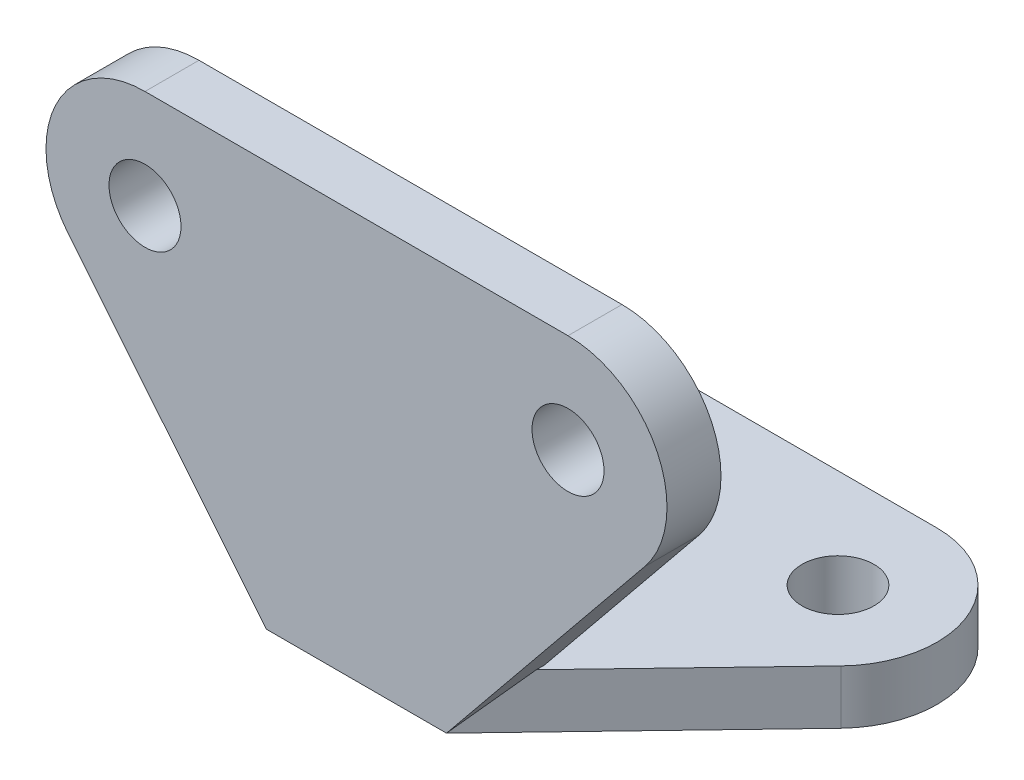
ISO-10303-21;
HEADER;
FILE_DESCRIPTION(('STEP AP214'),'2;1');
FILE_NAME('part.step','',(''),(''),'','','');
FILE_SCHEMA(('AUTOMOTIVE_DESIGN { 1 0 10303 214 1 1 1 1 }'));
ENDSEC;
DATA;
#1=APPLICATION_CONTEXT('core data for automotive mechanical design processes');
#2=APPLICATION_PROTOCOL_DEFINITION('international standard','automotive_design',2000,#1);
#3=PRODUCT_CONTEXT('',#1,'mechanical');
#4=PRODUCT('Part','Part','',(#3));
#5=PRODUCT_RELATED_PRODUCT_CATEGORY('part','',(#4));
#6=PRODUCT_DEFINITION_FORMATION('','',#4);
#7=PRODUCT_DEFINITION_CONTEXT('part definition',#1,'design');
#8=PRODUCT_DEFINITION('design','',#6,#7);
#9=PRODUCT_DEFINITION_SHAPE('','',#8);
#10=(LENGTH_UNIT() NAMED_UNIT(*) SI_UNIT(.MILLI.,.METRE.));
#11=(NAMED_UNIT(*) PLANE_ANGLE_UNIT() SI_UNIT($,.RADIAN.));
#12=(NAMED_UNIT(*) SI_UNIT($,.STERADIAN.) SOLID_ANGLE_UNIT());
#13=UNCERTAINTY_MEASURE_WITH_UNIT(LENGTH_MEASURE(1.E-05),#10,'distance_accuracy_value','');
#14=(GEOMETRIC_REPRESENTATION_CONTEXT(3) GLOBAL_UNCERTAINTY_ASSIGNED_CONTEXT((#13)) GLOBAL_UNIT_ASSIGNED_CONTEXT((#10,
#11,#12)) REPRESENTATION_CONTEXT('',''));
#15=CARTESIAN_POINT('',(0.,0.,0.));
#16=DIRECTION('',(0.,0.,1.));
#17=DIRECTION('',(1.,0.,0.));
#18=AXIS2_PLACEMENT_3D('',#15,#16,#17);
#19=CARTESIAN_POINT('',(-11.75,3.,0.));
#20=DIRECTION('',(0.,-1.,0.));
#21=DIRECTION('',(0.,0.,-1.));
#22=AXIS2_PLACEMENT_3D('',#19,#20,#21);
#23=PLANE('',#22);
#24=CARTESIAN_POINT('',(11.75,3.,0.));
#25=DIRECTION('',(0.,1.,0.));
#26=DIRECTION('',(0.,0.,1.));
#27=AXIS2_PLACEMENT_3D('',#24,#25,#26);
#28=CIRCLE('',#27,2.);
#29=CARTESIAN_POINT('',(11.75,3.,2.));
#30=VERTEX_POINT('',#29);
#31=EDGE_CURVE('E158',#30,#30,#28,.T.);
#32=ORIENTED_EDGE('',*,*,#31,.F.);
#33=EDGE_LOOP('',(#32));
#34=FACE_BOUND('',#33,.T.);
#35=CARTESIAN_POINT('',(-11.75,3.,0.));
#36=DIRECTION('',(0.,1.,0.));
#37=DIRECTION('',(0.,0.,1.));
#38=AXIS2_PLACEMENT_3D('',#35,#36,#37);
#39=CIRCLE('',#38,2.);
#40=CARTESIAN_POINT('',(-11.75,3.,2.));
#41=VERTEX_POINT('',#40);
#42=EDGE_CURVE('E167',#41,#41,#39,.T.);
#43=ORIENTED_EDGE('',*,*,#42,.F.);
#44=EDGE_LOOP('',(#43));
#45=FACE_BOUND('',#44,.T.);
#46=DIRECTION('',(0.,0.,-1.));
#47=VECTOR('',#46,1.);
#48=CARTESIAN_POINT('',(-5.,3.,3.80415742729705));
#49=LINE('',#48,#47);
#50=CARTESIAN_POINT('',(-5.,3.,12.));
#51=VERTEX_POINT('',#50);
#52=CARTESIAN_POINT('',(-5.,3.,3.80415742729705));
#53=VERTEX_POINT('',#52);
#54=EDGE_CURVE('E510',#51,#53,#49,.T.);
#55=ORIENTED_EDGE('',*,*,#54,.T.);
#56=DIRECTION('',(1.,0.,0.));
#57=VECTOR('',#56,1.);
#58=CARTESIAN_POINT('',(-5.,3.,3.80415742729705));
#59=LINE('',#58,#57);
#60=CARTESIAN_POINT('',(5.,3.,3.80415742729705));
#61=VERTEX_POINT('',#60);
#62=EDGE_CURVE('E149',#53,#61,#59,.T.);
#63=ORIENTED_EDGE('',*,*,#62,.T.);
#64=DIRECTION('',(0.,0.,-1.));
#65=VECTOR('',#64,1.);
#66=CARTESIAN_POINT('',(5.,3.,3.80415742729705));
#67=LINE('',#66,#65);
#68=CARTESIAN_POINT('',(5.,3.,12.));
#69=VERTEX_POINT('',#68);
#70=EDGE_CURVE('E140',#69,#61,#67,.T.);
#71=ORIENTED_EDGE('',*,*,#70,.F.);
#72=DIRECTION('',(-1.,0.,0.));
#73=VECTOR('',#72,1.);
#74=CARTESIAN_POINT('',(-11.75,3.,12.));
#75=LINE('',#74,#73);
#76=CARTESIAN_POINT('',(7.44284118996303,3.,12.));
#77=VERTEX_POINT('',#76);
#78=EDGE_CURVE('E147',#77,#69,#75,.T.);
#79=ORIENTED_EDGE('',*,*,#78,.F.);
#80=DIRECTION('',(0.,0.,1.));
#81=VECTOR('',#80,1.);
#82=CARTESIAN_POINT('',(7.44284118996303,3.,0.));
#83=LINE('',#82,#81);
#84=CARTESIAN_POINT('',(7.44284118996303,3.,12.4492491203827));
#85=VERTEX_POINT('',#84);
#86=EDGE_CURVE('E238',#77,#85,#83,.T.);
#87=ORIENTED_EDGE('',*,*,#86,.T.);
#88=DIRECTION('',(0.691664986781282,0.,-0.72221848914359));
#89=VECTOR('',#88,1.);
#90=CARTESIAN_POINT('',(15.7222016902897,3.,3.80415742729705));
#91=LINE('',#90,#89);
#92=CARTESIAN_POINT('',(15.7222016902897,3.,3.80415742729705));
#93=VERTEX_POINT('',#92);
#94=EDGE_CURVE('E180',#85,#93,#91,.T.);
#95=ORIENTED_EDGE('',*,*,#94,.T.);
#96=CARTESIAN_POINT('',(11.75,3.,0.));
#97=DIRECTION('',(0.,1.,0.));
#98=DIRECTION('',(0.,0.,-1.));
#99=AXIS2_PLACEMENT_3D('',#96,#97,#98);
#100=CIRCLE('',#99,5.5);
#101=CARTESIAN_POINT('',(11.75,3.,-5.5));
#102=VERTEX_POINT('',#101);
#103=EDGE_CURVE('E182',#93,#102,#100,.T.);
#104=ORIENTED_EDGE('',*,*,#103,.T.);
#105=DIRECTION('',(-1.,0.,0.));
#106=VECTOR('',#105,1.);
#107=CARTESIAN_POINT('',(-11.75,3.,-5.5));
#108=LINE('',#107,#106);
#109=CARTESIAN_POINT('',(-11.75,3.,-5.5));
#110=VERTEX_POINT('',#109);
#111=EDGE_CURVE('E184',#102,#110,#108,.T.);
#112=ORIENTED_EDGE('',*,*,#111,.T.);
#113=CARTESIAN_POINT('',(-11.75,3.,0.));
#114=DIRECTION('',(0.,1.,0.));
#115=DIRECTION('',(0.,0.,-1.));
#116=AXIS2_PLACEMENT_3D('',#113,#114,#115);
#117=CIRCLE('',#116,5.5);
#118=CARTESIAN_POINT('',(-15.7222016902897,3.,3.80415742729705));
#119=VERTEX_POINT('',#118);
#120=EDGE_CURVE('E173',#110,#119,#117,.T.);
#121=ORIENTED_EDGE('',*,*,#120,.T.);
#122=DIRECTION('',(0.691664986781282,0.,0.722218489143589));
#123=VECTOR('',#122,1.);
#124=CARTESIAN_POINT('',(-5.,3.,15.));
#125=LINE('',#124,#123);
#126=CARTESIAN_POINT('',(-7.44284118996303,3.,12.4492491203827));
#127=VERTEX_POINT('',#126);
#128=EDGE_CURVE('E176',#119,#127,#125,.T.);
#129=ORIENTED_EDGE('',*,*,#128,.T.);
#130=DIRECTION('',(0.,0.,-1.));
#131=VECTOR('',#130,1.);
#132=CARTESIAN_POINT('',(-7.44284118996303,3.,0.));
#133=LINE('',#132,#131);
#134=CARTESIAN_POINT('',(-7.44284118996303,3.,12.));
#135=VERTEX_POINT('',#134);
#136=EDGE_CURVE('E160',#127,#135,#133,.T.);
#137=ORIENTED_EDGE('',*,*,#136,.T.);
#138=EDGE_CURVE('E60',#51,#135,#75,.T.);
#139=ORIENTED_EDGE('',*,*,#138,.F.);
#140=EDGE_LOOP('',(#55,#63,#71,#79,#87,#95,#104,#112,#121,#129,#137,#139));
#141=FACE_BOUND('',#140,.T.);
#142=ADVANCED_FACE('F36',(#34,#45,#141),#23,.F.);
#143=CARTESIAN_POINT('',(11.75,16.9999999999999,12.));
#144=DIRECTION('',(0.,0.,1.));
#145=DIRECTION('',(1.,0.,0.));
#146=AXIS2_PLACEMENT_3D('',#143,#144,#145);
#147=PLANE('',#146);
#148=CARTESIAN_POINT('',(11.75,16.9999999999999,12.));
#149=DIRECTION('',(0.,0.,1.));
#150=DIRECTION('',(1.,0.,0.));
#151=AXIS2_PLACEMENT_3D('',#148,#149,#150);
#152=CIRCLE('',#151,2.);
#153=CARTESIAN_POINT('',(13.75,16.9999999999999,12.));
#154=VERTEX_POINT('',#153);
#155=EDGE_CURVE('E262',#154,#154,#152,.T.);
#156=ORIENTED_EDGE('',*,*,#155,.T.);
#157=EDGE_LOOP('',(#156));
#158=FACE_BOUND('',#157,.T.);
#159=CARTESIAN_POINT('',(-11.75,16.9999999999999,12.));
#160=DIRECTION('',(0.,0.,1.));
#161=DIRECTION('',(1.,0.,0.));
#162=AXIS2_PLACEMENT_3D('',#159,#160,#161);
#163=CIRCLE('',#162,2.);
#164=CARTESIAN_POINT('',(-9.75,16.9999999999999,12.));
#165=VERTEX_POINT('',#164);
#166=EDGE_CURVE('E519',#165,#165,#163,.T.);
#167=ORIENTED_EDGE('',*,*,#166,.T.);
#168=EDGE_LOOP('',(#167));
#169=FACE_BOUND('',#168,.T.);
#170=DIRECTION('',(0.,-1.,0.));
#171=VECTOR('',#170,1.);
#172=CARTESIAN_POINT('',(-5.,3.,12.));
#173=LINE('',#172,#171);
#174=CARTESIAN_POINT('',(-5.,13.5271687493917,12.));
#175=VERTEX_POINT('',#174);
#176=EDGE_CURVE('E508',#175,#51,#173,.T.);
#177=ORIENTED_EDGE('',*,*,#176,.T.);
#178=ORIENTED_EDGE('',*,*,#138,.T.);
#179=DIRECTION('',(0.631423863746935,-0.775437879066332,0.));
#180=VECTOR('',#179,1.);
#181=CARTESIAN_POINT('',(-16.0149083348649,13.5271687493917,12.));
#182=LINE('',#181,#180);
#183=CARTESIAN_POINT('',(-16.0149083348649,13.5271687493917,12.));
#184=VERTEX_POINT('',#183);
#185=EDGE_CURVE('E248',#184,#135,#182,.T.);
#186=ORIENTED_EDGE('',*,*,#185,.F.);
#187=CARTESIAN_POINT('',(-11.75,16.9999999999999,12.));
#188=DIRECTION('',(0.,0.,1.));
#189=DIRECTION('',(1.,0.,0.));
#190=AXIS2_PLACEMENT_3D('',#187,#188,#189);
#191=CIRCLE('',#190,5.5000000000001);
#192=CARTESIAN_POINT('',(-11.75,22.5,12.));
#193=VERTEX_POINT('',#192);
#194=EDGE_CURVE('E253',#193,#184,#191,.T.);
#195=ORIENTED_EDGE('',*,*,#194,.F.);
#196=DIRECTION('',(-1.,0.,0.));
#197=VECTOR('',#196,1.);
#198=CARTESIAN_POINT('',(11.75,22.5,12.));
#199=LINE('',#198,#197);
#200=CARTESIAN_POINT('',(11.75,22.5,12.));
#201=VERTEX_POINT('',#200);
#202=EDGE_CURVE('E230',#201,#193,#199,.T.);
#203=ORIENTED_EDGE('',*,*,#202,.F.);
#204=CARTESIAN_POINT('',(11.75,16.9999999999999,12.));
#205=DIRECTION('',(0.,0.,1.));
#206=DIRECTION('',(1.,0.,0.));
#207=AXIS2_PLACEMENT_3D('',#204,#205,#206);
#208=CIRCLE('',#207,5.50000000000009);
#209=CARTESIAN_POINT('',(16.0149083348649,13.5271687493917,12.));
#210=VERTEX_POINT('',#209);
#211=EDGE_CURVE('E226',#210,#201,#208,.T.);
#212=ORIENTED_EDGE('',*,*,#211,.F.);
#213=DIRECTION('',(0.631423863746935,0.775437879066332,0.));
#214=VECTOR('',#213,1.);
#215=CARTESIAN_POINT('',(5.,0.,12.));
#216=LINE('',#215,#214);
#217=EDGE_CURVE('E154',#77,#210,#216,.T.);
#218=ORIENTED_EDGE('',*,*,#217,.F.);
#219=ORIENTED_EDGE('',*,*,#78,.T.);
#220=DIRECTION('',(0.,-1.,0.));
#221=VECTOR('',#220,1.);
#222=CARTESIAN_POINT('',(5.,3.,12.));
#223=LINE('',#222,#221);
#224=CARTESIAN_POINT('',(5.,13.5271687493917,12.));
#225=VERTEX_POINT('',#224);
#226=EDGE_CURVE('E137',#225,#69,#223,.T.);
#227=ORIENTED_EDGE('',*,*,#226,.F.);
#228=DIRECTION('',(1.,0.,0.));
#229=VECTOR('',#228,1.);
#230=CARTESIAN_POINT('',(-5.,13.5271687493917,12.));
#231=LINE('',#230,#229);
#232=EDGE_CURVE('E515',#175,#225,#231,.T.);
#233=ORIENTED_EDGE('',*,*,#232,.F.);
#234=EDGE_LOOP('',(#177,#178,#186,#195,#203,#212,#218,#219,#227,#233));
#235=FACE_BOUND('',#234,.T.);
#236=ADVANCED_FACE('F152',(#158,#169,#235),#147,.F.);
#237=CARTESIAN_POINT('',(-11.75,0.,0.));
#238=DIRECTION('',(0.,-1.,0.));
#239=DIRECTION('',(0.,0.,-1.));
#240=AXIS2_PLACEMENT_3D('',#237,#238,#239);
#241=PLANE('',#240);
#242=DIRECTION('',(0.691664986781282,0.,-0.72221848914359));
#243=VECTOR('',#242,1.);
#244=CARTESIAN_POINT('',(15.7222016902897,0.,3.80415742729705));
#245=LINE('',#244,#243);
#246=CARTESIAN_POINT('',(5.,0.,15.));
#247=VERTEX_POINT('',#246);
#248=CARTESIAN_POINT('',(15.7222016902897,0.,3.80415742729705));
#249=VERTEX_POINT('',#248);
#250=EDGE_CURVE('E194',#247,#249,#245,.T.);
#251=ORIENTED_EDGE('',*,*,#250,.F.);
#252=DIRECTION('',(1.,0.,0.));
#253=VECTOR('',#252,1.);
#254=CARTESIAN_POINT('',(5.,0.,15.));
#255=LINE('',#254,#253);
#256=CARTESIAN_POINT('',(-5.,0.,15.));
#257=VERTEX_POINT('',#256);
#258=EDGE_CURVE('E191',#257,#247,#255,.T.);
#259=ORIENTED_EDGE('',*,*,#258,.F.);
#260=DIRECTION('',(0.691664986781282,0.,0.722218489143589));
#261=VECTOR('',#260,1.);
#262=CARTESIAN_POINT('',(-5.,0.,15.));
#263=LINE('',#262,#261);
#264=CARTESIAN_POINT('',(-15.7222016902897,0.,3.80415742729705));
#265=VERTEX_POINT('',#264);
#266=EDGE_CURVE('E189',#265,#257,#263,.T.);
#267=ORIENTED_EDGE('',*,*,#266,.F.);
#268=CARTESIAN_POINT('',(-11.75,0.,0.));
#269=DIRECTION('',(0.,1.,0.));
#270=DIRECTION('',(0.,0.,-1.));
#271=AXIS2_PLACEMENT_3D('',#268,#269,#270);
#272=CIRCLE('',#271,5.5);
#273=CARTESIAN_POINT('',(-11.75,0.,-5.5));
#274=VERTEX_POINT('',#273);
#275=EDGE_CURVE('E170',#274,#265,#272,.T.);
#276=ORIENTED_EDGE('',*,*,#275,.F.);
#277=DIRECTION('',(-1.,0.,0.));
#278=VECTOR('',#277,1.);
#279=CARTESIAN_POINT('',(-11.75,0.,-5.5));
#280=LINE('',#279,#278);
#281=CARTESIAN_POINT('',(11.75,0.,-5.5));
#282=VERTEX_POINT('',#281);
#283=EDGE_CURVE('E177',#282,#274,#280,.T.);
#284=ORIENTED_EDGE('',*,*,#283,.F.);
#285=CARTESIAN_POINT('',(11.75,0.,0.));
#286=DIRECTION('',(0.,1.,0.));
#287=DIRECTION('',(0.,0.,-1.));
#288=AXIS2_PLACEMENT_3D('',#285,#286,#287);
#289=CIRCLE('',#288,5.5);
#290=EDGE_CURVE('E196',#249,#282,#289,.T.);
#291=ORIENTED_EDGE('',*,*,#290,.F.);
#292=EDGE_LOOP('',(#251,#259,#267,#276,#284,#291));
#293=FACE_BOUND('',#292,.T.);
#294=CARTESIAN_POINT('',(-11.75,0.,0.));
#295=DIRECTION('',(0.,1.,0.));
#296=DIRECTION('',(0.,0.,1.));
#297=AXIS2_PLACEMENT_3D('',#294,#295,#296);
#298=CIRCLE('',#297,2.);
#299=CARTESIAN_POINT('',(-11.75,0.,2.));
#300=VERTEX_POINT('',#299);
#301=EDGE_CURVE('E165',#300,#300,#298,.T.);
#302=ORIENTED_EDGE('',*,*,#301,.T.);
#303=EDGE_LOOP('',(#302));
#304=FACE_BOUND('',#303,.T.);
#305=CARTESIAN_POINT('',(11.75,0.,0.));
#306=DIRECTION('',(0.,1.,0.));
#307=DIRECTION('',(0.,0.,1.));
#308=AXIS2_PLACEMENT_3D('',#305,#306,#307);
#309=CIRCLE('',#308,2.);
#310=CARTESIAN_POINT('',(11.75,0.,2.));
#311=VERTEX_POINT('',#310);
#312=EDGE_CURVE('E155',#311,#311,#309,.T.);
#313=ORIENTED_EDGE('',*,*,#312,.T.);
#314=EDGE_LOOP('',(#313));
#315=FACE_BOUND('',#314,.T.);
#316=ADVANCED_FACE('F277',(#293,#304,#315),#241,.T.);
#317=CARTESIAN_POINT('',(-11.75,3.,0.));
#318=DIRECTION('',(0.,-1.,0.));
#319=DIRECTION('',(0.,0.,-1.));
#320=AXIS2_PLACEMENT_3D('',#317,#318,#319);
#321=CYLINDRICAL_SURFACE('',#320,5.5);
#322=ORIENTED_EDGE('',*,*,#275,.T.);
#323=DIRECTION('',(0.,-1.,0.));
#324=VECTOR('',#323,1.);
#325=CARTESIAN_POINT('',(-15.7222016902897,3.,3.80415742729705));
#326=LINE('',#325,#324);
#327=EDGE_CURVE('E207',#119,#265,#326,.T.);
#328=ORIENTED_EDGE('',*,*,#327,.F.);
#329=ORIENTED_EDGE('',*,*,#120,.F.);
#330=DIRECTION('',(0.,-1.,0.));
#331=VECTOR('',#330,1.);
#332=CARTESIAN_POINT('',(-11.75,3.,-5.5));
#333=LINE('',#332,#331);
#334=EDGE_CURVE('E186',#110,#274,#333,.T.);
#335=ORIENTED_EDGE('',*,*,#334,.T.);
#336=EDGE_LOOP('',(#322,#328,#329,#335));
#337=FACE_BOUND('',#336,.T.);
#338=ADVANCED_FACE('F38',(#337),#321,.T.);
#339=CARTESIAN_POINT('',(-5.,3.,15.));
#340=DIRECTION('',(0.722218489143589,0.,-0.691664986781282));
#341=DIRECTION('',(-0.691664986781282,0.,-0.72221848914359));
#342=AXIS2_PLACEMENT_3D('',#339,#340,#341);
#343=PLANE('',#342);
#344=ORIENTED_EDGE('',*,*,#266,.T.);
#345=DIRECTION('',(-0.527157938103045,0.647391169269203,-0.550444531489959));
#346=VECTOR('',#345,1.);
#347=CARTESIAN_POINT('',(-6.02383218181422,1.25734597814324,13.9309412134226));
#348=LINE('',#347,#346);
#349=EDGE_CURVE('E11',#257,#127,#348,.T.);
#350=ORIENTED_EDGE('',*,*,#349,.T.);
#351=ORIENTED_EDGE('',*,*,#128,.F.);
#352=ORIENTED_EDGE('',*,*,#327,.T.);
#353=EDGE_LOOP('',(#344,#350,#351,#352));
#354=FACE_BOUND('',#353,.T.);
#355=ADVANCED_FACE('F272',(#354),#343,.F.);
#356=CARTESIAN_POINT('',(5.,3.,15.));
#357=DIRECTION('',(0.,0.,-1.));
#358=DIRECTION('',(-1.,0.,0.));
#359=AXIS2_PLACEMENT_3D('',#356,#357,#358);
#360=PLANE('',#359);
#361=DIRECTION('',(0.631423863746935,-0.775437879066332,0.));
#362=VECTOR('',#361,1.);
#363=CARTESIAN_POINT('',(-16.0149083348649,13.5271687493917,15.));
#364=LINE('',#363,#362);
#365=CARTESIAN_POINT('',(-16.0149083348649,13.5271687493917,15.));
#366=VERTEX_POINT('',#365);
#367=EDGE_CURVE('E227',#366,#257,#364,.T.);
#368=ORIENTED_EDGE('',*,*,#367,.T.);
#369=ORIENTED_EDGE('',*,*,#258,.T.);
#370=DIRECTION('',(0.631423863746935,0.775437879066332,0.));
#371=VECTOR('',#370,1.);
#372=CARTESIAN_POINT('',(5.,0.,15.));
#373=LINE('',#372,#371);
#374=CARTESIAN_POINT('',(16.0149083348649,13.5271687493917,15.));
#375=VERTEX_POINT('',#374);
#376=EDGE_CURVE('E219',#247,#375,#373,.T.);
#377=ORIENTED_EDGE('',*,*,#376,.T.);
#378=CARTESIAN_POINT('',(11.75,16.9999999999999,15.));
#379=DIRECTION('',(0.,0.,1.));
#380=DIRECTION('',(1.,0.,0.));
#381=AXIS2_PLACEMENT_3D('',#378,#379,#380);
#382=CIRCLE('',#381,5.50000000000009);
#383=CARTESIAN_POINT('',(11.75,22.5,15.));
#384=VERTEX_POINT('',#383);
#385=EDGE_CURVE('E259',#375,#384,#382,.T.);
#386=ORIENTED_EDGE('',*,*,#385,.T.);
#387=DIRECTION('',(-1.,0.,0.));
#388=VECTOR('',#387,1.);
#389=CARTESIAN_POINT('',(11.75,22.5,15.));
#390=LINE('',#389,#388);
#391=CARTESIAN_POINT('',(-11.75,22.5,15.));
#392=VERTEX_POINT('',#391);
#393=EDGE_CURVE('E261',#384,#392,#390,.T.);
#394=ORIENTED_EDGE('',*,*,#393,.T.);
#395=CARTESIAN_POINT('',(-11.75,16.9999999999999,15.));
#396=DIRECTION('',(0.,0.,1.));
#397=DIRECTION('',(1.,0.,0.));
#398=AXIS2_PLACEMENT_3D('',#395,#396,#397);
#399=CIRCLE('',#398,5.5000000000001);
#400=EDGE_CURVE('E233',#392,#366,#399,.T.);
#401=ORIENTED_EDGE('',*,*,#400,.T.);
#402=EDGE_LOOP('',(#368,#369,#377,#386,#394,#401));
#403=FACE_BOUND('',#402,.T.);
#404=CARTESIAN_POINT('',(11.75,16.9999999999999,15.));
#405=DIRECTION('',(0.,0.,1.));
#406=DIRECTION('',(1.,0.,0.));
#407=AXIS2_PLACEMENT_3D('',#404,#405,#406);
#408=CIRCLE('',#407,2.);
#409=CARTESIAN_POINT('',(13.75,16.9999999999999,15.));
#410=VERTEX_POINT('',#409);
#411=EDGE_CURVE('E522',#410,#410,#408,.T.);
#412=ORIENTED_EDGE('',*,*,#411,.F.);
#413=EDGE_LOOP('',(#412));
#414=FACE_BOUND('',#413,.T.);
#415=CARTESIAN_POINT('',(-11.75,16.9999999999999,15.));
#416=DIRECTION('',(0.,0.,1.));
#417=DIRECTION('',(1.,0.,0.));
#418=AXIS2_PLACEMENT_3D('',#415,#416,#417);
#419=CIRCLE('',#418,2.);
#420=CARTESIAN_POINT('',(-9.75,16.9999999999999,15.));
#421=VERTEX_POINT('',#420);
#422=EDGE_CURVE('E517',#421,#421,#419,.T.);
#423=ORIENTED_EDGE('',*,*,#422,.F.);
#424=EDGE_LOOP('',(#423));
#425=FACE_BOUND('',#424,.T.);
#426=ADVANCED_FACE('F266',(#403,#414,#425),#360,.F.);
#427=CARTESIAN_POINT('',(15.7222016902897,3.,3.80415742729705));
#428=DIRECTION('',(-0.72221848914359,0.,-0.691664986781282));
#429=DIRECTION('',(-0.691664986781282,0.,0.72221848914359));
#430=AXIS2_PLACEMENT_3D('',#427,#428,#429);
#431=PLANE('',#430);
#432=ORIENTED_EDGE('',*,*,#94,.F.);
#433=DIRECTION('',(-0.527157938103045,-0.647391169269203,0.550444531489959));
#434=VECTOR('',#433,1.);
#435=CARTESIAN_POINT('',(12.2521948147285,8.90626232011207,7.42744785095731));
#436=LINE('',#435,#434);
#437=EDGE_CURVE('E45',#85,#247,#436,.T.);
#438=ORIENTED_EDGE('',*,*,#437,.T.);
#439=ORIENTED_EDGE('',*,*,#250,.T.);
#440=DIRECTION('',(0.,-1.,0.));
#441=VECTOR('',#440,1.);
#442=CARTESIAN_POINT('',(15.7222016902897,3.,3.80415742729705));
#443=LINE('',#442,#441);
#444=EDGE_CURVE('E204',#93,#249,#443,.T.);
#445=ORIENTED_EDGE('',*,*,#444,.F.);
#446=EDGE_LOOP('',(#432,#438,#439,#445));
#447=FACE_BOUND('',#446,.T.);
#448=ADVANCED_FACE('F215',(#447),#431,.F.);
#449=CARTESIAN_POINT('',(11.75,3.,0.));
#450=DIRECTION('',(0.,-1.,0.));
#451=DIRECTION('',(0.,0.,-1.));
#452=AXIS2_PLACEMENT_3D('',#449,#450,#451);
#453=CYLINDRICAL_SURFACE('',#452,5.5);
#454=ORIENTED_EDGE('',*,*,#290,.T.);
#455=DIRECTION('',(0.,-1.,0.));
#456=VECTOR('',#455,1.);
#457=CARTESIAN_POINT('',(11.75,3.,-5.5));
#458=LINE('',#457,#456);
#459=EDGE_CURVE('E201',#102,#282,#458,.T.);
#460=ORIENTED_EDGE('',*,*,#459,.F.);
#461=ORIENTED_EDGE('',*,*,#103,.F.);
#462=ORIENTED_EDGE('',*,*,#444,.T.);
#463=EDGE_LOOP('',(#454,#460,#461,#462));
#464=FACE_BOUND('',#463,.T.);
#465=ADVANCED_FACE('F283',(#464),#453,.T.);
#466=CARTESIAN_POINT('',(-11.75,3.,-5.5));
#467=DIRECTION('',(0.,0.,1.));
#468=DIRECTION('',(1.,0.,0.));
#469=AXIS2_PLACEMENT_3D('',#466,#467,#468);
#470=PLANE('',#469);
#471=ORIENTED_EDGE('',*,*,#283,.T.);
#472=ORIENTED_EDGE('',*,*,#334,.F.);
#473=ORIENTED_EDGE('',*,*,#111,.F.);
#474=ORIENTED_EDGE('',*,*,#459,.T.);
#475=EDGE_LOOP('',(#471,#472,#473,#474));
#476=FACE_BOUND('',#475,.T.);
#477=ADVANCED_FACE('F287',(#476),#470,.F.);
#478=CARTESIAN_POINT('',(-11.75,3.,0.));
#479=DIRECTION('',(0.,-1.,0.));
#480=DIRECTION('',(0.,0.,-1.));
#481=AXIS2_PLACEMENT_3D('',#478,#479,#480);
#482=CYLINDRICAL_SURFACE('',#481,2.);
#483=ORIENTED_EDGE('',*,*,#42,.T.);
#484=EDGE_LOOP('',(#483));
#485=FACE_BOUND('',#484,.T.);
#486=ORIENTED_EDGE('',*,*,#301,.F.);
#487=EDGE_LOOP('',(#486));
#488=FACE_BOUND('',#487,.T.);
#489=ADVANCED_FACE('F308',(#485,#488),#482,.F.);
#490=CARTESIAN_POINT('',(11.75,3.,0.));
#491=DIRECTION('',(0.,-1.,0.));
#492=DIRECTION('',(0.,0.,-1.));
#493=AXIS2_PLACEMENT_3D('',#490,#491,#492);
#494=CYLINDRICAL_SURFACE('',#493,2.);
#495=ORIENTED_EDGE('',*,*,#31,.T.);
#496=EDGE_LOOP('',(#495));
#497=FACE_BOUND('',#496,.T.);
#498=ORIENTED_EDGE('',*,*,#312,.F.);
#499=EDGE_LOOP('',(#498));
#500=FACE_BOUND('',#499,.T.);
#501=ADVANCED_FACE('F341',(#497,#500),#494,.F.);
#502=CARTESIAN_POINT('',(-16.0149083348649,13.5271687493917,12.));
#503=DIRECTION('',(-0.775437879066332,-0.631423863746935,0.));
#504=DIRECTION('',(0.631423863746935,-0.775437879066332,0.));
#505=AXIS2_PLACEMENT_3D('',#502,#503,#504);
#506=PLANE('',#505);
#507=ORIENTED_EDGE('',*,*,#136,.F.);
#508=ORIENTED_EDGE('',*,*,#349,.F.);
#509=ORIENTED_EDGE('',*,*,#367,.F.);
#510=DIRECTION('',(0.,0.,1.));
#511=VECTOR('',#510,1.);
#512=CARTESIAN_POINT('',(-16.0149083348649,13.5271687493917,12.));
#513=LINE('',#512,#511);
#514=EDGE_CURVE('E239',#184,#366,#513,.T.);
#515=ORIENTED_EDGE('',*,*,#514,.F.);
#516=ORIENTED_EDGE('',*,*,#185,.T.);
#517=EDGE_LOOP('',(#507,#508,#509,#515,#516));
#518=FACE_BOUND('',#517,.T.);
#519=ADVANCED_FACE('F249',(#518),#506,.T.);
#520=CARTESIAN_POINT('',(5.,0.,12.));
#521=DIRECTION('',(0.775437879066332,-0.631423863746935,0.));
#522=DIRECTION('',(0.631423863746935,0.775437879066333,0.));
#523=AXIS2_PLACEMENT_3D('',#520,#521,#522);
#524=PLANE('',#523);
#525=ORIENTED_EDGE('',*,*,#86,.F.);
#526=ORIENTED_EDGE('',*,*,#217,.T.);
#527=DIRECTION('',(0.,0.,1.));
#528=VECTOR('',#527,1.);
#529=CARTESIAN_POINT('',(16.0149083348649,13.5271687493917,12.));
#530=LINE('',#529,#528);
#531=EDGE_CURVE('E222',#210,#375,#530,.T.);
#532=ORIENTED_EDGE('',*,*,#531,.T.);
#533=ORIENTED_EDGE('',*,*,#376,.F.);
#534=ORIENTED_EDGE('',*,*,#437,.F.);
#535=EDGE_LOOP('',(#525,#526,#532,#533,#534));
#536=FACE_BOUND('',#535,.T.);
#537=ADVANCED_FACE('F220',(#536),#524,.T.);
#538=CARTESIAN_POINT('',(11.75,16.9999999999999,12.));
#539=DIRECTION('',(0.,0.,1.));
#540=DIRECTION('',(1.,0.,0.));
#541=AXIS2_PLACEMENT_3D('',#538,#539,#540);
#542=CYLINDRICAL_SURFACE('',#541,5.50000000000009);
#543=ORIENTED_EDGE('',*,*,#385,.F.);
#544=ORIENTED_EDGE('',*,*,#531,.F.);
#545=ORIENTED_EDGE('',*,*,#211,.T.);
#546=DIRECTION('',(0.,0.,1.));
#547=VECTOR('',#546,1.);
#548=CARTESIAN_POINT('',(11.75,22.5,12.));
#549=LINE('',#548,#547);
#550=EDGE_CURVE('E243',#201,#384,#549,.T.);
#551=ORIENTED_EDGE('',*,*,#550,.T.);
#552=EDGE_LOOP('',(#543,#544,#545,#551));
#553=FACE_BOUND('',#552,.T.);
#554=ADVANCED_FACE('F360',(#553),#542,.T.);
#555=CARTESIAN_POINT('',(-11.75,16.9999999999999,12.));
#556=DIRECTION('',(0.,0.,1.));
#557=DIRECTION('',(1.,0.,0.));
#558=AXIS2_PLACEMENT_3D('',#555,#556,#557);
#559=CYLINDRICAL_SURFACE('',#558,5.5000000000001);
#560=ORIENTED_EDGE('',*,*,#400,.F.);
#561=DIRECTION('',(0.,0.,1.));
#562=VECTOR('',#561,1.);
#563=CARTESIAN_POINT('',(-11.75,22.5,12.));
#564=LINE('',#563,#562);
#565=EDGE_CURVE('E241',#193,#392,#564,.T.);
#566=ORIENTED_EDGE('',*,*,#565,.F.);
#567=ORIENTED_EDGE('',*,*,#194,.T.);
#568=ORIENTED_EDGE('',*,*,#514,.T.);
#569=EDGE_LOOP('',(#560,#566,#567,#568));
#570=FACE_BOUND('',#569,.T.);
#571=ADVANCED_FACE('F270',(#570),#559,.T.);
#572=CARTESIAN_POINT('',(11.75,22.5,12.));
#573=DIRECTION('',(0.,1.,0.));
#574=DIRECTION('',(0.,0.,1.));
#575=AXIS2_PLACEMENT_3D('',#572,#573,#574);
#576=PLANE('',#575);
#577=ORIENTED_EDGE('',*,*,#393,.F.);
#578=ORIENTED_EDGE('',*,*,#550,.F.);
#579=ORIENTED_EDGE('',*,*,#202,.T.);
#580=ORIENTED_EDGE('',*,*,#565,.T.);
#581=EDGE_LOOP('',(#577,#578,#579,#580));
#582=FACE_BOUND('',#581,.T.);
#583=ADVANCED_FACE('F374',(#582),#576,.T.);
#584=CARTESIAN_POINT('',(11.75,16.9999999999999,12.));
#585=DIRECTION('',(0.,0.,1.));
#586=DIRECTION('',(1.,0.,0.));
#587=AXIS2_PLACEMENT_3D('',#584,#585,#586);
#588=CYLINDRICAL_SURFACE('',#587,2.);
#589=ORIENTED_EDGE('',*,*,#155,.F.);
#590=EDGE_LOOP('',(#589));
#591=FACE_BOUND('',#590,.T.);
#592=ORIENTED_EDGE('',*,*,#411,.T.);
#593=EDGE_LOOP('',(#592));
#594=FACE_BOUND('',#593,.T.);
#595=ADVANCED_FACE('F381',(#591,#594),#588,.F.);
#596=CARTESIAN_POINT('',(-11.75,16.9999999999999,12.));
#597=DIRECTION('',(0.,0.,1.));
#598=DIRECTION('',(1.,0.,0.));
#599=AXIS2_PLACEMENT_3D('',#596,#597,#598);
#600=CYLINDRICAL_SURFACE('',#599,2.);
#601=ORIENTED_EDGE('',*,*,#166,.F.);
#602=EDGE_LOOP('',(#601));
#603=FACE_BOUND('',#602,.T.);
#604=ORIENTED_EDGE('',*,*,#422,.T.);
#605=EDGE_LOOP('',(#604));
#606=FACE_BOUND('',#605,.T.);
#607=ADVANCED_FACE('F389',(#603,#606),#600,.F.);
#608=CARTESIAN_POINT('',(-5.,13.5271687493917,12.));
#609=DIRECTION('',(0.,0.614316249484987,-0.789059912566023));
#610=DIRECTION('',(0.,0.789059912566023,0.614316249484987));
#611=AXIS2_PLACEMENT_3D('',#608,#609,#610);
#612=PLANE('',#611);
#613=CARTESIAN_POINT('',(0.,8.3218366555416,7.94743055844917));
#614=DIRECTION('',(0.,0.614316249484987,-0.789059912566023));
#615=DIRECTION('',(0.,-0.789059912566023,-0.614316249484987));
#616=AXIS2_PLACEMENT_3D('',#613,#614,#615);
#617=ELLIPSE('',#616,3.25565212002239,2.);
#618=CARTESIAN_POINT('',(0.,5.75293207837135,5.94743055844917));
#619=VERTEX_POINT('',#618);
#620=EDGE_CURVE('E40',#619,#619,#617,.F.);
#621=ORIENTED_EDGE('',*,*,#620,.T.);
#622=EDGE_LOOP('',(#621));
#623=FACE_BOUND('',#622,.T.);
#624=ORIENTED_EDGE('',*,*,#232,.T.);
#625=DIRECTION('',(0.,0.789059912566023,0.614316249484987));
#626=VECTOR('',#625,1.);
#627=CARTESIAN_POINT('',(5.,13.5271687493917,12.));
#628=LINE('',#627,#626);
#629=EDGE_CURVE('E52',#61,#225,#628,.T.);
#630=ORIENTED_EDGE('',*,*,#629,.F.);
#631=ORIENTED_EDGE('',*,*,#62,.F.);
#632=DIRECTION('',(0.,0.789059912566023,0.614316249484987));
#633=VECTOR('',#632,1.);
#634=CARTESIAN_POINT('',(-5.,13.5271687493917,12.));
#635=LINE('',#634,#633);
#636=EDGE_CURVE('E512',#53,#175,#635,.T.);
#637=ORIENTED_EDGE('',*,*,#636,.T.);
#638=EDGE_LOOP('',(#624,#630,#631,#637));
#639=FACE_BOUND('',#638,.T.);
#640=ADVANCED_FACE('F397',(#623,#639),#612,.T.);
#641=CARTESIAN_POINT('',(-5.,0.,0.));
#642=DIRECTION('',(1.,0.,0.));
#643=DIRECTION('',(0.,0.,-1.));
#644=AXIS2_PLACEMENT_3D('',#641,#642,#643);
#645=PLANE('',#644);
#646=ORIENTED_EDGE('',*,*,#176,.F.);
#647=ORIENTED_EDGE('',*,*,#636,.F.);
#648=ORIENTED_EDGE('',*,*,#54,.F.);
#649=EDGE_LOOP('',(#646,#647,#648));
#650=FACE_BOUND('',#649,.T.);
#651=ADVANCED_FACE('F405',(#650),#645,.F.);
#652=CARTESIAN_POINT('',(5.,0.,0.));
#653=DIRECTION('',(1.,0.,0.));
#654=DIRECTION('',(0.,0.,-1.));
#655=AXIS2_PLACEMENT_3D('',#652,#653,#654);
#656=PLANE('',#655);
#657=ORIENTED_EDGE('',*,*,#226,.T.);
#658=ORIENTED_EDGE('',*,*,#70,.T.);
#659=ORIENTED_EDGE('',*,*,#629,.T.);
#660=EDGE_LOOP('',(#657,#658,#659));
#661=FACE_BOUND('',#660,.T.);
#662=ADVANCED_FACE('F139',(#661),#656,.T.);
#663=CARTESIAN_POINT('',(0.,22.5,7.94743055844917));
#664=DIRECTION('',(0.,-1.,0.));
#665=DIRECTION('',(0.,0.,-1.));
#666=AXIS2_PLACEMENT_3D('',#663,#664,#665);
#667=CYLINDRICAL_SURFACE('',#666,2.);
#668=ORIENTED_EDGE('',*,*,#620,.F.);
#669=EDGE_LOOP('',(#668));
#670=FACE_BOUND('',#669,.T.);
#671=CARTESIAN_POINT('',(0.,3.,7.94743055844917));
#672=DIRECTION('',(0.,1.,0.));
#673=DIRECTION('',(0.,0.,1.));
#674=AXIS2_PLACEMENT_3D('',#671,#672,#673);
#675=CIRCLE('',#674,2.);
#676=CARTESIAN_POINT('',(0.,3.,9.94743055844917));
#677=VERTEX_POINT('',#676);
#678=EDGE_CURVE('E502',#677,#677,#675,.T.);
#679=ORIENTED_EDGE('',*,*,#678,.F.);
#680=EDGE_LOOP('',(#679));
#681=FACE_BOUND('',#680,.T.);
#682=ADVANCED_FACE('F422',(#670,#681),#667,.F.);
#683=CARTESIAN_POINT('',(0.,3.,7.94743055844917));
#684=DIRECTION('',(0.,1.,0.));
#685=DIRECTION('',(0.,0.,1.));
#686=AXIS2_PLACEMENT_3D('',#683,#684,#685);
#687=PLANE('',#686);
#688=ORIENTED_EDGE('',*,*,#678,.T.);
#689=EDGE_LOOP('',(#688));
#690=FACE_BOUND('',#689,.T.);
#691=ADVANCED_FACE('F428',(#690),#687,.T.);
#692=CLOSED_SHELL('',(#142,#236,#316,#338,#355,#426,#448,#465,#477,#489,#501,#519,#537,#554,
#571,#583,#595,#607,#640,#651,#662,#682,#691));
#693=MANIFOLD_SOLID_BREP('B2',#692);
#694=ADVANCED_BREP_SHAPE_REPRESENTATION('',(#18,#693),#14);
#695=SHAPE_DEFINITION_REPRESENTATION(#9,#694);
ENDSEC;
END-ISO-10303-21;
